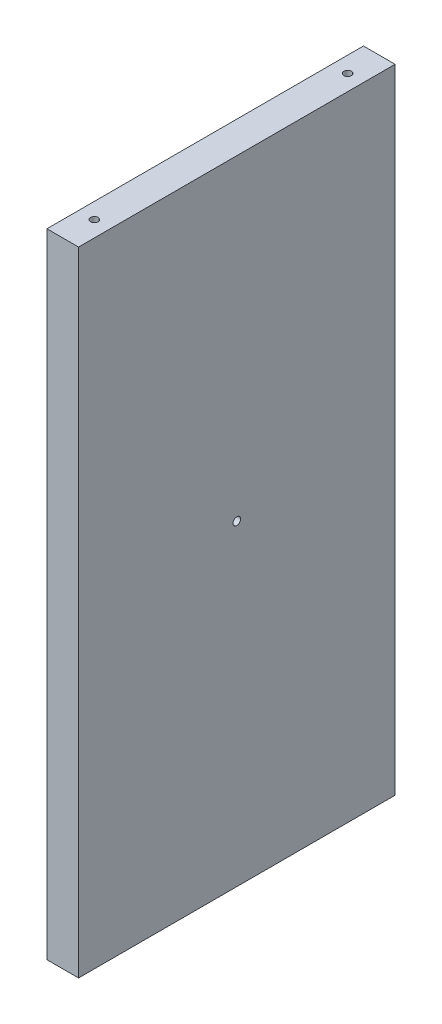
ISO-10303-21;
HEADER;
FILE_DESCRIPTION(('STEP AP214'),'2;1');
FILE_NAME('part.step','',(''),(''),'','','');
FILE_SCHEMA(('AUTOMOTIVE_DESIGN { 1 0 10303 214 1 1 1 1 }'));
ENDSEC;
DATA;
#1=APPLICATION_CONTEXT('core data for automotive mechanical design processes');
#2=APPLICATION_PROTOCOL_DEFINITION('international standard','automotive_design',2000,#1);
#3=PRODUCT_CONTEXT('',#1,'mechanical');
#4=PRODUCT('Part','Part','',(#3));
#5=PRODUCT_RELATED_PRODUCT_CATEGORY('part','',(#4));
#6=PRODUCT_DEFINITION_FORMATION('','',#4);
#7=PRODUCT_DEFINITION_CONTEXT('part definition',#1,'design');
#8=PRODUCT_DEFINITION('design','',#6,#7);
#9=PRODUCT_DEFINITION_SHAPE('','',#8);
#10=(LENGTH_UNIT() NAMED_UNIT(*) SI_UNIT(.MILLI.,.METRE.));
#11=(NAMED_UNIT(*) PLANE_ANGLE_UNIT() SI_UNIT($,.RADIAN.));
#12=(NAMED_UNIT(*) SI_UNIT($,.STERADIAN.) SOLID_ANGLE_UNIT());
#13=UNCERTAINTY_MEASURE_WITH_UNIT(LENGTH_MEASURE(1.E-05),#10,'distance_accuracy_value','');
#14=(GEOMETRIC_REPRESENTATION_CONTEXT(3) GLOBAL_UNCERTAINTY_ASSIGNED_CONTEXT((#13)) GLOBAL_UNIT_ASSIGNED_CONTEXT((#10,
#11,#12)) REPRESENTATION_CONTEXT('',''));
#15=CARTESIAN_POINT('',(0.,0.,0.));
#16=DIRECTION('',(0.,0.,1.));
#17=DIRECTION('',(1.,0.,0.));
#18=AXIS2_PLACEMENT_3D('',#15,#16,#17);
#19=CARTESIAN_POINT('',(5.,200.,-50.));
#20=DIRECTION('',(-1.,0.,0.));
#21=DIRECTION('',(0.,0.,1.));
#22=AXIS2_PLACEMENT_3D('',#19,#20,#21);
#23=PLANE('',#22);
#24=CARTESIAN_POINT('',(5.00000000000001,100.,0.));
#25=DIRECTION('',(-1.,0.,0.));
#26=DIRECTION('',(0.,0.,1.));
#27=AXIS2_PLACEMENT_3D('',#24,#25,#26);
#28=CIRCLE('',#27,1.19999999999999);
#29=CARTESIAN_POINT('',(5.00000000000001,100.,1.19999999999999));
#30=VERTEX_POINT('',#29);
#31=EDGE_CURVE('E110',#30,#30,#28,.T.);
#32=ORIENTED_EDGE('',*,*,#31,.T.);
#33=EDGE_LOOP('',(#32));
#34=FACE_BOUND('',#33,.T.);
#35=DIRECTION('',(0.,0.,-1.));
#36=VECTOR('',#35,1.);
#37=CARTESIAN_POINT('',(5.,0.,-50.));
#38=LINE('',#37,#36);
#39=CARTESIAN_POINT('',(5.00000000000001,0.,50.));
#40=VERTEX_POINT('',#39);
#41=CARTESIAN_POINT('',(5.,0.,-50.));
#42=VERTEX_POINT('',#41);
#43=EDGE_CURVE('E128',#40,#42,#38,.T.);
#44=ORIENTED_EDGE('',*,*,#43,.T.);
#45=DIRECTION('',(0.,-1.,0.));
#46=VECTOR('',#45,1.);
#47=CARTESIAN_POINT('',(5.,200.,-50.));
#48=LINE('',#47,#46);
#49=CARTESIAN_POINT('',(5.,200.,-50.));
#50=VERTEX_POINT('',#49);
#51=EDGE_CURVE('E11',#50,#42,#48,.T.);
#52=ORIENTED_EDGE('',*,*,#51,.F.);
#53=DIRECTION('',(0.,0.,-1.));
#54=VECTOR('',#53,1.);
#55=CARTESIAN_POINT('',(5.,200.,-50.));
#56=LINE('',#55,#54);
#57=CARTESIAN_POINT('',(5.00000000000001,200.,50.));
#58=VERTEX_POINT('',#57);
#59=EDGE_CURVE('E129',#58,#50,#56,.T.);
#60=ORIENTED_EDGE('',*,*,#59,.F.);
#61=DIRECTION('',(0.,-1.,0.));
#62=VECTOR('',#61,1.);
#63=CARTESIAN_POINT('',(5.00000000000001,200.,50.));
#64=LINE('',#63,#62);
#65=EDGE_CURVE('E135',#58,#40,#64,.T.);
#66=ORIENTED_EDGE('',*,*,#65,.T.);
#67=EDGE_LOOP('',(#44,#52,#60,#66));
#68=FACE_BOUND('',#67,.T.);
#69=ADVANCED_FACE('F33',(#34,#68),#23,.F.);
#70=CARTESIAN_POINT('',(-5.00000000000001,200.,-50.));
#71=DIRECTION('',(0.,0.,1.));
#72=DIRECTION('',(1.,0.,0.));
#73=AXIS2_PLACEMENT_3D('',#70,#71,#72);
#74=PLANE('',#73);
#75=DIRECTION('',(-1.,0.,0.));
#76=VECTOR('',#75,1.);
#77=CARTESIAN_POINT('',(-5.00000000000001,0.,-50.));
#78=LINE('',#77,#76);
#79=CARTESIAN_POINT('',(-5.00000000000001,0.,-50.));
#80=VERTEX_POINT('',#79);
#81=EDGE_CURVE('E138',#42,#80,#78,.T.);
#82=ORIENTED_EDGE('',*,*,#81,.T.);
#83=DIRECTION('',(0.,-1.,0.));
#84=VECTOR('',#83,1.);
#85=CARTESIAN_POINT('',(-5.00000000000001,200.,-50.));
#86=LINE('',#85,#84);
#87=CARTESIAN_POINT('',(-5.00000000000001,200.,-50.));
#88=VERTEX_POINT('',#87);
#89=EDGE_CURVE('E41',#88,#80,#86,.T.);
#90=ORIENTED_EDGE('',*,*,#89,.F.);
#91=DIRECTION('',(-1.,0.,0.));
#92=VECTOR('',#91,1.);
#93=CARTESIAN_POINT('',(-5.00000000000001,200.,-50.));
#94=LINE('',#93,#92);
#95=EDGE_CURVE('E80',#50,#88,#94,.T.);
#96=ORIENTED_EDGE('',*,*,#95,.F.);
#97=ORIENTED_EDGE('',*,*,#51,.T.);
#98=EDGE_LOOP('',(#82,#90,#96,#97));
#99=FACE_BOUND('',#98,.T.);
#100=ADVANCED_FACE('F163',(#99),#74,.F.);
#101=CARTESIAN_POINT('',(-5.00000000000001,200.,-50.));
#102=DIRECTION('',(1.,0.,0.));
#103=DIRECTION('',(0.,0.,-1.));
#104=AXIS2_PLACEMENT_3D('',#101,#102,#103);
#105=PLANE('',#104);
#106=CARTESIAN_POINT('',(-5.,100.,0.));
#107=DIRECTION('',(-1.,0.,0.));
#108=DIRECTION('',(0.,0.,1.));
#109=AXIS2_PLACEMENT_3D('',#106,#107,#108);
#110=CIRCLE('',#109,1.19999999999999);
#111=CARTESIAN_POINT('',(-5.,100.,1.19999999999999));
#112=VERTEX_POINT('',#111);
#113=EDGE_CURVE('E176',#112,#112,#110,.T.);
#114=ORIENTED_EDGE('',*,*,#113,.F.);
#115=EDGE_LOOP('',(#114));
#116=FACE_BOUND('',#115,.T.);
#117=DIRECTION('',(0.,0.,1.));
#118=VECTOR('',#117,1.);
#119=CARTESIAN_POINT('',(-5.00000000000001,0.,-50.));
#120=LINE('',#119,#118);
#121=CARTESIAN_POINT('',(-4.99999999999999,0.,50.));
#122=VERTEX_POINT('',#121);
#123=EDGE_CURVE('E67',#80,#122,#120,.T.);
#124=ORIENTED_EDGE('',*,*,#123,.T.);
#125=DIRECTION('',(0.,-1.,0.));
#126=VECTOR('',#125,1.);
#127=CARTESIAN_POINT('',(-4.99999999999999,200.,50.));
#128=LINE('',#127,#126);
#129=CARTESIAN_POINT('',(-4.99999999999999,200.,50.));
#130=VERTEX_POINT('',#129);
#131=EDGE_CURVE('E143',#130,#122,#128,.T.);
#132=ORIENTED_EDGE('',*,*,#131,.F.);
#133=DIRECTION('',(0.,0.,1.));
#134=VECTOR('',#133,1.);
#135=CARTESIAN_POINT('',(-5.00000000000001,200.,-50.));
#136=LINE('',#135,#134);
#137=EDGE_CURVE('E132',#88,#130,#136,.T.);
#138=ORIENTED_EDGE('',*,*,#137,.F.);
#139=ORIENTED_EDGE('',*,*,#89,.T.);
#140=EDGE_LOOP('',(#124,#132,#138,#139));
#141=FACE_BOUND('',#140,.T.);
#142=ADVANCED_FACE('F145',(#116,#141),#105,.F.);
#143=CARTESIAN_POINT('',(-4.99999999999999,200.,50.));
#144=DIRECTION('',(0.,0.,-1.));
#145=DIRECTION('',(-1.,0.,0.));
#146=AXIS2_PLACEMENT_3D('',#143,#144,#145);
#147=PLANE('',#146);
#148=DIRECTION('',(1.,0.,0.));
#149=VECTOR('',#148,1.);
#150=CARTESIAN_POINT('',(-4.99999999999999,0.,50.));
#151=LINE('',#150,#149);
#152=EDGE_CURVE('E73',#122,#40,#151,.T.);
#153=ORIENTED_EDGE('',*,*,#152,.T.);
#154=ORIENTED_EDGE('',*,*,#65,.F.);
#155=DIRECTION('',(1.,0.,0.));
#156=VECTOR('',#155,1.);
#157=CARTESIAN_POINT('',(-4.99999999999999,200.,50.));
#158=LINE('',#157,#156);
#159=EDGE_CURVE('E49',#130,#58,#158,.T.);
#160=ORIENTED_EDGE('',*,*,#159,.F.);
#161=ORIENTED_EDGE('',*,*,#131,.T.);
#162=EDGE_LOOP('',(#153,#154,#160,#161));
#163=FACE_BOUND('',#162,.T.);
#164=ADVANCED_FACE('F152',(#163),#147,.F.);
#165=CARTESIAN_POINT('',(0.,200.,0.));
#166=DIRECTION('',(0.,1.,0.));
#167=DIRECTION('',(0.,0.,1.));
#168=AXIS2_PLACEMENT_3D('',#165,#166,#167);
#169=PLANE('',#168);
#170=CARTESIAN_POINT('',(0.,200.,-40.));
#171=DIRECTION('',(0.,1.,0.));
#172=DIRECTION('',(0.,0.,1.));
#173=AXIS2_PLACEMENT_3D('',#170,#171,#172);
#174=CIRCLE('',#173,1.19999999999999);
#175=CARTESIAN_POINT('',(0.,200.,-38.8));
#176=VERTEX_POINT('',#175);
#177=EDGE_CURVE('E116',#176,#176,#174,.T.);
#178=ORIENTED_EDGE('',*,*,#177,.F.);
#179=EDGE_LOOP('',(#178));
#180=FACE_BOUND('',#179,.T.);
#181=CARTESIAN_POINT('',(0.,200.,40.));
#182=DIRECTION('',(0.,1.,0.));
#183=DIRECTION('',(0.,0.,1.));
#184=AXIS2_PLACEMENT_3D('',#181,#182,#183);
#185=CIRCLE('',#184,1.19999999999999);
#186=CARTESIAN_POINT('',(0.,200.,41.2));
#187=VERTEX_POINT('',#186);
#188=EDGE_CURVE('E122',#187,#187,#185,.T.);
#189=ORIENTED_EDGE('',*,*,#188,.F.);
#190=EDGE_LOOP('',(#189));
#191=FACE_BOUND('',#190,.T.);
#192=ORIENTED_EDGE('',*,*,#59,.T.);
#193=ORIENTED_EDGE('',*,*,#95,.T.);
#194=ORIENTED_EDGE('',*,*,#137,.T.);
#195=ORIENTED_EDGE('',*,*,#159,.T.);
#196=EDGE_LOOP('',(#192,#193,#194,#195));
#197=FACE_BOUND('',#196,.T.);
#198=ADVANCED_FACE('F154',(#180,#191,#197),#169,.T.);
#199=CARTESIAN_POINT('',(0.,0.,0.));
#200=DIRECTION('',(0.,1.,0.));
#201=DIRECTION('',(0.,0.,1.));
#202=AXIS2_PLACEMENT_3D('',#199,#200,#201);
#203=PLANE('',#202);
#204=CARTESIAN_POINT('',(0.,0.,-40.));
#205=DIRECTION('',(0.,-1.,0.));
#206=DIRECTION('',(0.,0.,-1.));
#207=AXIS2_PLACEMENT_3D('',#204,#205,#206);
#208=CIRCLE('',#207,1.19999999999999);
#209=CARTESIAN_POINT('',(0.,0.,-41.2));
#210=VERTEX_POINT('',#209);
#211=EDGE_CURVE('E104',#210,#210,#208,.T.);
#212=ORIENTED_EDGE('',*,*,#211,.F.);
#213=EDGE_LOOP('',(#212));
#214=FACE_BOUND('',#213,.T.);
#215=CARTESIAN_POINT('',(0.,0.,40.));
#216=DIRECTION('',(0.,-1.,0.));
#217=DIRECTION('',(0.,0.,-1.));
#218=AXIS2_PLACEMENT_3D('',#215,#216,#217);
#219=CIRCLE('',#218,1.19999999999999);
#220=CARTESIAN_POINT('',(0.,0.,38.8));
#221=VERTEX_POINT('',#220);
#222=EDGE_CURVE('E103',#221,#221,#219,.T.);
#223=ORIENTED_EDGE('',*,*,#222,.F.);
#224=EDGE_LOOP('',(#223));
#225=FACE_BOUND('',#224,.T.);
#226=ORIENTED_EDGE('',*,*,#43,.F.);
#227=ORIENTED_EDGE('',*,*,#152,.F.);
#228=ORIENTED_EDGE('',*,*,#123,.F.);
#229=ORIENTED_EDGE('',*,*,#81,.F.);
#230=EDGE_LOOP('',(#226,#227,#228,#229));
#231=FACE_BOUND('',#230,.T.);
#232=ADVANCED_FACE('F148',(#214,#225,#231),#203,.F.);
#233=CARTESIAN_POINT('',(0.,189.,40.));
#234=DIRECTION('',(0.,1.,0.));
#235=DIRECTION('',(0.,0.,1.));
#236=AXIS2_PLACEMENT_3D('',#233,#234,#235);
#237=CONICAL_SURFACE('',#236,1.2,1.02974425867666);
#238=CARTESIAN_POINT('',(0.,188.278967257167,40.));
#239=VERTEX_POINT('',#238);
#240=VERTEX_LOOP('',#239);
#241=FACE_BOUND('',#240,.T.);
#242=CARTESIAN_POINT('',(0.,189.,40.));
#243=DIRECTION('',(0.,1.,0.));
#244=DIRECTION('',(0.,0.,1.));
#245=AXIS2_PLACEMENT_3D('',#242,#243,#244);
#246=CIRCLE('',#245,1.2);
#247=CARTESIAN_POINT('',(0.,189.,41.2));
#248=VERTEX_POINT('',#247);
#249=EDGE_CURVE('E125',#248,#248,#246,.T.);
#250=ORIENTED_EDGE('',*,*,#249,.T.);
#251=EDGE_LOOP('',(#250));
#252=FACE_BOUND('',#251,.T.);
#253=ADVANCED_FACE('F207',(#241,#252),#237,.F.);
#254=CARTESIAN_POINT('',(0.,200.,40.));
#255=DIRECTION('',(0.,1.,0.));
#256=DIRECTION('',(0.,0.,1.));
#257=AXIS2_PLACEMENT_3D('',#254,#255,#256);
#258=CYLINDRICAL_SURFACE('',#257,1.19999999999999);
#259=ORIENTED_EDGE('',*,*,#249,.F.);
#260=EDGE_LOOP('',(#259));
#261=FACE_BOUND('',#260,.T.);
#262=ORIENTED_EDGE('',*,*,#188,.T.);
#263=EDGE_LOOP('',(#262));
#264=FACE_BOUND('',#263,.T.);
#265=ADVANCED_FACE('F203',(#261,#264),#258,.F.);
#266=CARTESIAN_POINT('',(0.,189.,-40.));
#267=DIRECTION('',(0.,1.,0.));
#268=DIRECTION('',(0.,0.,1.));
#269=AXIS2_PLACEMENT_3D('',#266,#267,#268);
#270=CONICAL_SURFACE('',#269,1.2,1.02974425867666);
#271=CARTESIAN_POINT('',(0.,188.278967257167,-40.));
#272=VERTEX_POINT('',#271);
#273=VERTEX_LOOP('',#272);
#274=FACE_BOUND('',#273,.T.);
#275=CARTESIAN_POINT('',(0.,189.,-40.));
#276=DIRECTION('',(0.,1.,0.));
#277=DIRECTION('',(0.,0.,1.));
#278=AXIS2_PLACEMENT_3D('',#275,#276,#277);
#279=CIRCLE('',#278,1.2);
#280=CARTESIAN_POINT('',(0.,189.,-38.8));
#281=VERTEX_POINT('',#280);
#282=EDGE_CURVE('E119',#281,#281,#279,.T.);
#283=ORIENTED_EDGE('',*,*,#282,.T.);
#284=EDGE_LOOP('',(#283));
#285=FACE_BOUND('',#284,.T.);
#286=ADVANCED_FACE('F199',(#274,#285),#270,.F.);
#287=CARTESIAN_POINT('',(0.,200.,-40.));
#288=DIRECTION('',(0.,1.,0.));
#289=DIRECTION('',(0.,0.,1.));
#290=AXIS2_PLACEMENT_3D('',#287,#288,#289);
#291=CYLINDRICAL_SURFACE('',#290,1.19999999999999);
#292=ORIENTED_EDGE('',*,*,#282,.F.);
#293=EDGE_LOOP('',(#292));
#294=FACE_BOUND('',#293,.T.);
#295=ORIENTED_EDGE('',*,*,#177,.T.);
#296=EDGE_LOOP('',(#295));
#297=FACE_BOUND('',#296,.T.);
#298=ADVANCED_FACE('F195',(#294,#297),#291,.F.);
#299=CARTESIAN_POINT('',(0.,11.,40.));
#300=DIRECTION('',(0.,-1.,0.));
#301=DIRECTION('',(0.,0.,-1.));
#302=AXIS2_PLACEMENT_3D('',#299,#300,#301);
#303=CONICAL_SURFACE('',#302,1.19999999999999,1.02974425867665);
#304=CARTESIAN_POINT('',(0.,11.7210327428331,40.));
#305=VERTEX_POINT('',#304);
#306=VERTEX_LOOP('',#305);
#307=FACE_BOUND('',#306,.T.);
#308=CARTESIAN_POINT('',(0.,11.,40.));
#309=DIRECTION('',(0.,-1.,0.));
#310=DIRECTION('',(0.,0.,-1.));
#311=AXIS2_PLACEMENT_3D('',#308,#309,#310);
#312=CIRCLE('',#311,1.19999999999999);
#313=CARTESIAN_POINT('',(0.,11.,38.8));
#314=VERTEX_POINT('',#313);
#315=EDGE_CURVE('E107',#314,#314,#312,.T.);
#316=ORIENTED_EDGE('',*,*,#315,.T.);
#317=EDGE_LOOP('',(#316));
#318=FACE_BOUND('',#317,.T.);
#319=ADVANCED_FACE('F191',(#307,#318),#303,.F.);
#320=CARTESIAN_POINT('',(0.,0.,40.));
#321=DIRECTION('',(0.,-1.,0.));
#322=DIRECTION('',(0.,0.,-1.));
#323=AXIS2_PLACEMENT_3D('',#320,#321,#322);
#324=CYLINDRICAL_SURFACE('',#323,1.19999999999999);
#325=ORIENTED_EDGE('',*,*,#315,.F.);
#326=EDGE_LOOP('',(#325));
#327=FACE_BOUND('',#326,.T.);
#328=ORIENTED_EDGE('',*,*,#222,.T.);
#329=EDGE_LOOP('',(#328));
#330=FACE_BOUND('',#329,.T.);
#331=ADVANCED_FACE('F97',(#327,#330),#324,.F.);
#332=CARTESIAN_POINT('',(0.,11.,-40.));
#333=DIRECTION('',(0.,-1.,0.));
#334=DIRECTION('',(0.,0.,-1.));
#335=AXIS2_PLACEMENT_3D('',#332,#333,#334);
#336=CONICAL_SURFACE('',#335,1.19999999999999,1.02974425867665);
#337=CARTESIAN_POINT('',(0.,11.7210327428331,-40.));
#338=VERTEX_POINT('',#337);
#339=VERTEX_LOOP('',#338);
#340=FACE_BOUND('',#339,.T.);
#341=CARTESIAN_POINT('',(0.,11.,-40.));
#342=DIRECTION('',(0.,-1.,0.));
#343=DIRECTION('',(0.,0.,-1.));
#344=AXIS2_PLACEMENT_3D('',#341,#342,#343);
#345=CIRCLE('',#344,1.19999999999999);
#346=CARTESIAN_POINT('',(0.,11.,-41.2));
#347=VERTEX_POINT('',#346);
#348=EDGE_CURVE('E101',#347,#347,#345,.T.);
#349=ORIENTED_EDGE('',*,*,#348,.T.);
#350=EDGE_LOOP('',(#349));
#351=FACE_BOUND('',#350,.T.);
#352=ADVANCED_FACE('F93',(#340,#351),#336,.F.);
#353=CARTESIAN_POINT('',(0.,0.,-40.));
#354=DIRECTION('',(0.,-1.,0.));
#355=DIRECTION('',(0.,0.,-1.));
#356=AXIS2_PLACEMENT_3D('',#353,#354,#355);
#357=CYLINDRICAL_SURFACE('',#356,1.19999999999999);
#358=ORIENTED_EDGE('',*,*,#348,.F.);
#359=EDGE_LOOP('',(#358));
#360=FACE_BOUND('',#359,.T.);
#361=ORIENTED_EDGE('',*,*,#211,.T.);
#362=EDGE_LOOP('',(#361));
#363=FACE_BOUND('',#362,.T.);
#364=ADVANCED_FACE('F96',(#360,#363),#357,.F.);
#365=CARTESIAN_POINT('',(-5.,100.,0.));
#366=DIRECTION('',(-1.,0.,0.));
#367=DIRECTION('',(0.,0.,1.));
#368=AXIS2_PLACEMENT_3D('',#365,#366,#367);
#369=CYLINDRICAL_SURFACE('',#368,1.19999999999999);
#370=ORIENTED_EDGE('',*,*,#31,.F.);
#371=EDGE_LOOP('',(#370));
#372=FACE_BOUND('',#371,.T.);
#373=ORIENTED_EDGE('',*,*,#113,.T.);
#374=EDGE_LOOP('',(#373));
#375=FACE_BOUND('',#374,.T.);
#376=ADVANCED_FACE('F181',(#372,#375),#369,.F.);
#377=CLOSED_SHELL('',(#69,#100,#142,#164,#198,#232,#253,#265,#286,#298,#319,#331,#352,#364,#376));
#378=MANIFOLD_SOLID_BREP('B2',#377);
#379=ADVANCED_BREP_SHAPE_REPRESENTATION('',(#18,#378),#14);
#380=SHAPE_DEFINITION_REPRESENTATION(#9,#379);
ENDSEC;
END-ISO-10303-21;
